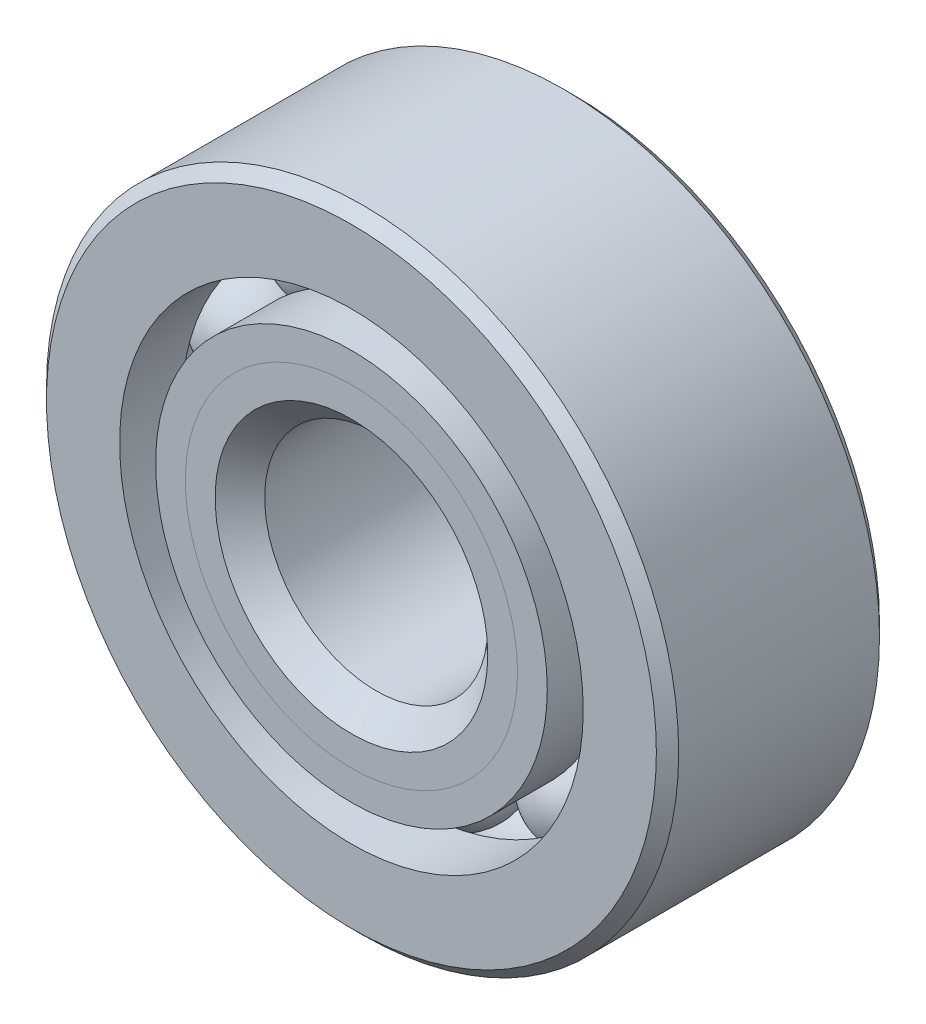
ISO-10303-21;
HEADER;
FILE_DESCRIPTION(('STEP AP214'),'2;1');
FILE_NAME('part.step','',(''),(''),'','','');
FILE_SCHEMA(('AUTOMOTIVE_DESIGN { 1 0 10303 214 1 1 1 1 }'));
ENDSEC;
DATA;
#1=APPLICATION_CONTEXT('core data for automotive mechanical design processes');
#2=APPLICATION_PROTOCOL_DEFINITION('international standard','automotive_design',2000,#1);
#3=PRODUCT_CONTEXT('',#1,'mechanical');
#4=PRODUCT('Part','Part','',(#3));
#5=PRODUCT_RELATED_PRODUCT_CATEGORY('part','',(#4));
#6=PRODUCT_DEFINITION_FORMATION('','',#4);
#7=PRODUCT_DEFINITION_CONTEXT('part definition',#1,'design');
#8=PRODUCT_DEFINITION('design','',#6,#7);
#9=PRODUCT_DEFINITION_SHAPE('','',#8);
#10=(LENGTH_UNIT() NAMED_UNIT(*) SI_UNIT(.MILLI.,.METRE.));
#11=(NAMED_UNIT(*) PLANE_ANGLE_UNIT() SI_UNIT($,.RADIAN.));
#12=(NAMED_UNIT(*) SI_UNIT($,.STERADIAN.) SOLID_ANGLE_UNIT());
#13=UNCERTAINTY_MEASURE_WITH_UNIT(LENGTH_MEASURE(1.E-05),#10,'distance_accuracy_value','');
#14=(GEOMETRIC_REPRESENTATION_CONTEXT(3) GLOBAL_UNCERTAINTY_ASSIGNED_CONTEXT((#13)) GLOBAL_UNIT_ASSIGNED_CONTEXT((#10,
#11,#12)) REPRESENTATION_CONTEXT('',''));
#15=CARTESIAN_POINT('',(0.,0.,0.));
#16=DIRECTION('',(0.,0.,1.));
#17=DIRECTION('',(1.,0.,0.));
#18=AXIS2_PLACEMENT_3D('',#15,#16,#17);
#19=CARTESIAN_POINT('',(-3.37976520068166,4.65184771765599,0.));
#20=DIRECTION('',(0.,0.,1.));
#21=DIRECTION('',(-0.587785252292462,0.809016994374955,0.));
#22=AXIS2_PLACEMENT_3D('',#19,#20,#21);
#23=SPHERICAL_SURFACE('',#22,1.41829685454418);
#24=CARTESIAN_POINT('',(-3.37976520068166,4.65184771765599,1.41829685454418));
#25=VERTEX_POINT('',#24);
#26=VERTEX_LOOP('',#25);
#27=FACE_BOUND('',#26,.T.);
#28=ADVANCED_FACE('F37',(#27),#23,.T.);
#29=CLOSED_SHELL('',(#28));
#30=MANIFOLD_SOLID_BREP('B2',#29);
#31=CARTESIAN_POINT('',(-5.46857496869711,1.77684771765601,0.));
#32=DIRECTION('',(0.,0.,1.));
#33=DIRECTION('',(-0.95105651629515,0.309016994374958,0.));
#34=AXIS2_PLACEMENT_3D('',#31,#32,#33);
#35=SPHERICAL_SURFACE('',#34,1.41829685454418);
#36=CARTESIAN_POINT('',(-5.46857496869711,1.77684771765601,1.41829685454418));
#37=VERTEX_POINT('',#36);
#38=VERTEX_LOOP('',#37);
#39=FACE_BOUND('',#38,.T.);
#40=ADVANCED_FACE('F68',(#39),#35,.T.);
#41=CLOSED_SHELL('',(#40));
#42=MANIFOLD_SOLID_BREP('B6',#41);
#43=CARTESIAN_POINT('',(-5.46857496869715,-1.7768477176559,0.));
#44=DIRECTION('',(0.,0.,1.));
#45=DIRECTION('',(-0.951056516295157,-0.309016994374938,0.));
#46=AXIS2_PLACEMENT_3D('',#43,#44,#45);
#47=SPHERICAL_SURFACE('',#46,1.41829685454418);
#48=CARTESIAN_POINT('',(-5.46857496869715,-1.7768477176559,1.41829685454418));
#49=VERTEX_POINT('',#48);
#50=VERTEX_LOOP('',#49);
#51=FACE_BOUND('',#50,.T.);
#52=ADVANCED_FACE('F99',(#51),#47,.T.);
#53=CLOSED_SHELL('',(#52));
#54=MANIFOLD_SOLID_BREP('B33',#53);
#55=CARTESIAN_POINT('',(-3.37976520068176,-4.65184771765592,0.));
#56=DIRECTION('',(0.,0.,1.));
#57=DIRECTION('',(-0.58778525229248,-0.809016994374942,0.));
#58=AXIS2_PLACEMENT_3D('',#55,#56,#57);
#59=SPHERICAL_SURFACE('',#58,1.41829685454418);
#60=CARTESIAN_POINT('',(-3.37976520068176,-4.65184771765592,1.41829685454418));
#61=VERTEX_POINT('',#60);
#62=VERTEX_LOOP('',#61);
#63=FACE_BOUND('',#62,.T.);
#64=ADVANCED_FACE('F130',(#63),#59,.T.);
#65=CLOSED_SHELL('',(#64));
#66=MANIFOLD_SOLID_BREP('B64',#65);
#67=CARTESIAN_POINT('',(0.,-5.75,0.));
#68=DIRECTION('',(0.,0.,1.));
#69=DIRECTION('',(0.,-1.,0.));
#70=AXIS2_PLACEMENT_3D('',#67,#68,#69);
#71=SPHERICAL_SURFACE('',#70,1.41829685454418);
#72=CARTESIAN_POINT('',(0.,-5.75,1.41829685454418));
#73=VERTEX_POINT('',#72);
#74=VERTEX_LOOP('',#73);
#75=FACE_BOUND('',#74,.T.);
#76=ADVANCED_FACE('F161',(#75),#71,.T.);
#77=CLOSED_SHELL('',(#76));
#78=MANIFOLD_SOLID_BREP('B95',#77);
#79=CARTESIAN_POINT('',(3.37976520068169,-4.65184771765597,0.));
#80=DIRECTION('',(0.,0.,1.));
#81=DIRECTION('',(0.587785252292469,-0.809016994374951,0.));
#82=AXIS2_PLACEMENT_3D('',#79,#80,#81);
#83=SPHERICAL_SURFACE('',#82,1.41829685454418);
#84=CARTESIAN_POINT('',(3.37976520068169,-4.65184771765597,1.41829685454418));
#85=VERTEX_POINT('',#84);
#86=VERTEX_LOOP('',#85);
#87=FACE_BOUND('',#86,.T.);
#88=ADVANCED_FACE('F192',(#87),#83,.T.);
#89=CLOSED_SHELL('',(#88));
#90=MANIFOLD_SOLID_BREP('B126',#89);
#91=CARTESIAN_POINT('',(5.46857496869713,-1.77684771765597,0.));
#92=DIRECTION('',(0.,0.,1.));
#93=DIRECTION('',(0.951056516295152,-0.309016994374952,0.));
#94=AXIS2_PLACEMENT_3D('',#91,#92,#93);
#95=SPHERICAL_SURFACE('',#94,1.41829685454418);
#96=CARTESIAN_POINT('',(5.46857496869713,-1.77684771765597,1.41829685454418));
#97=VERTEX_POINT('',#96);
#98=VERTEX_LOOP('',#97);
#99=FACE_BOUND('',#98,.T.);
#100=ADVANCED_FACE('F223',(#99),#95,.T.);
#101=CLOSED_SHELL('',(#100));
#102=MANIFOLD_SOLID_BREP('B157',#101);
#103=CARTESIAN_POINT('',(5.46857496869714,1.77684771765593,0.));
#104=DIRECTION('',(0.,0.,1.));
#105=DIRECTION('',(0.951056516295155,0.309016994374945,0.));
#106=AXIS2_PLACEMENT_3D('',#103,#104,#105);
#107=SPHERICAL_SURFACE('',#106,1.41829685454418);
#108=CARTESIAN_POINT('',(5.46857496869714,1.77684771765593,1.41829685454418));
#109=VERTEX_POINT('',#108);
#110=VERTEX_LOOP('',#109);
#111=FACE_BOUND('',#110,.T.);
#112=ADVANCED_FACE('F254',(#111),#107,.T.);
#113=CLOSED_SHELL('',(#112));
#114=MANIFOLD_SOLID_BREP('B188',#113);
#115=CARTESIAN_POINT('',(3.37976520068173,4.65184771765594,0.));
#116=DIRECTION('',(0.,0.,1.));
#117=DIRECTION('',(0.587785252292474,0.809016994374947,0.));
#118=AXIS2_PLACEMENT_3D('',#115,#116,#117);
#119=SPHERICAL_SURFACE('',#118,1.41829685454418);
#120=CARTESIAN_POINT('',(3.37976520068173,4.65184771765594,1.41829685454418));
#121=VERTEX_POINT('',#120);
#122=VERTEX_LOOP('',#121);
#123=FACE_BOUND('',#122,.T.);
#124=ADVANCED_FACE('F285',(#123),#119,.T.);
#125=CLOSED_SHELL('',(#124));
#126=MANIFOLD_SOLID_BREP('B219',#125);
#127=CARTESIAN_POINT('',(0.,5.75,0.));
#128=DIRECTION('',(0.,0.,1.));
#129=DIRECTION('',(0.,1.,0.));
#130=AXIS2_PLACEMENT_3D('',#127,#128,#129);
#131=SPHERICAL_SURFACE('',#130,1.41829685454418);
#132=CARTESIAN_POINT('',(0.,5.75,1.41829685454418));
#133=VERTEX_POINT('',#132);
#134=VERTEX_LOOP('',#133);
#135=FACE_BOUND('',#134,.T.);
#136=ADVANCED_FACE('F318',(#135),#131,.T.);
#137=CLOSED_SHELL('',(#136));
#138=MANIFOLD_SOLID_BREP('B250',#137);
#139=CARTESIAN_POINT('',(0.,4.46616754460571,3.));
#140=DIRECTION('',(0.,0.,-1.));
#141=DIRECTION('',(-1.,0.,0.));
#142=AXIS2_PLACEMENT_3D('',#139,#140,#141);
#143=PLANE('',#142);
#144=CARTESIAN_POINT('',(0.,0.,3.));
#145=DIRECTION('',(0.,0.,1.));
#146=DIRECTION('',(1.,0.,0.));
#147=AXIS2_PLACEMENT_3D('',#144,#145,#146);
#148=CIRCLE('',#147,3.66585157272791);
#149=CARTESIAN_POINT('',(3.66585157272791,0.,3.));
#150=VERTEX_POINT('',#149);
#151=EDGE_CURVE('E372',#150,#150,#148,.T.);
#152=ORIENTED_EDGE('',*,*,#151,.F.);
#153=EDGE_LOOP('',(#152));
#154=FACE_BOUND('',#153,.T.);
#155=CARTESIAN_POINT('',(0.,0.,3.));
#156=DIRECTION('',(0.,0.,1.));
#157=DIRECTION('',(1.,0.,0.));
#158=AXIS2_PLACEMENT_3D('',#155,#156,#157);
#159=CIRCLE('',#158,4.46616754460571);
#160=CARTESIAN_POINT('',(4.46616754460571,0.,3.));
#161=VERTEX_POINT('',#160);
#162=EDGE_CURVE('E317',#161,#161,#159,.T.);
#163=ORIENTED_EDGE('',*,*,#162,.T.);
#164=EDGE_LOOP('',(#163));
#165=FACE_BOUND('',#164,.T.);
#166=ADVANCED_FACE('F338',(#154,#165),#143,.F.);
#167=CARTESIAN_POINT('',(0.,0.,2.1996840281222));
#168=DIRECTION('',(0.,0.,1.));
#169=DIRECTION('',(1.,0.,0.));
#170=AXIS2_PLACEMENT_3D('',#167,#168,#169);
#171=CONICAL_SURFACE('',#170,3.66585157272791,0.785398163397449);
#172=ORIENTED_EDGE('',*,*,#162,.F.);
#173=EDGE_LOOP('',(#172));
#174=FACE_BOUND('',#173,.T.);
#175=CARTESIAN_POINT('',(0.,0.,2.1996840281222));
#176=DIRECTION('',(0.,0.,1.));
#177=DIRECTION('',(1.,0.,0.));
#178=AXIS2_PLACEMENT_3D('',#175,#176,#177);
#179=CIRCLE('',#178,3.66585157272791);
#180=CARTESIAN_POINT('',(3.66585157272791,0.,2.1996840281222));
#181=VERTEX_POINT('',#180);
#182=EDGE_CURVE('E344',#181,#181,#179,.T.);
#183=ORIENTED_EDGE('',*,*,#182,.T.);
#184=EDGE_LOOP('',(#183));
#185=FACE_BOUND('',#184,.T.);
#186=ADVANCED_FACE('F379',(#174,#185),#171,.T.);
#187=CARTESIAN_POINT('',(0.,0.,3.));
#188=DIRECTION('',(0.,0.,1.));
#189=DIRECTION('',(1.,0.,0.));
#190=AXIS2_PLACEMENT_3D('',#187,#188,#189);
#191=CYLINDRICAL_SURFACE('',#190,3.66585157272791);
#192=ORIENTED_EDGE('',*,*,#182,.F.);
#193=EDGE_LOOP('',(#192));
#194=FACE_BOUND('',#193,.T.);
#195=CARTESIAN_POINT('',(0.,0.,0.));
#196=DIRECTION('',(0.,0.,1.));
#197=DIRECTION('',(1.,0.,0.));
#198=AXIS2_PLACEMENT_3D('',#195,#196,#197);
#199=CIRCLE('',#198,3.66585157272791);
#200=CARTESIAN_POINT('',(3.66585157272791,0.,0.));
#201=VERTEX_POINT('',#200);
#202=EDGE_CURVE('E348',#201,#201,#199,.T.);
#203=ORIENTED_EDGE('',*,*,#202,.T.);
#204=EDGE_LOOP('',(#203));
#205=FACE_BOUND('',#204,.T.);
#206=ADVANCED_FACE('F383',(#194,#205),#191,.T.);
#207=CARTESIAN_POINT('',(0.,3.66585157272791,0.));
#208=DIRECTION('',(0.,0.,-1.));
#209=DIRECTION('',(-1.,0.,0.));
#210=AXIS2_PLACEMENT_3D('',#207,#208,#209);
#211=PLANE('',#210);
#212=ORIENTED_EDGE('',*,*,#202,.F.);
#213=EDGE_LOOP('',(#212));
#214=FACE_BOUND('',#213,.T.);
#215=CARTESIAN_POINT('',(0.,0.,0.));
#216=DIRECTION('',(0.,0.,1.));
#217=DIRECTION('',(1.,0.,0.));
#218=AXIS2_PLACEMENT_3D('',#215,#216,#217);
#219=CIRCLE('',#218,4.33170314545582);
#220=CARTESIAN_POINT('',(4.33170314545582,0.,0.));
#221=VERTEX_POINT('',#220);
#222=EDGE_CURVE('E352',#221,#221,#219,.T.);
#223=ORIENTED_EDGE('',*,*,#222,.T.);
#224=EDGE_LOOP('',(#223));
#225=FACE_BOUND('',#224,.T.);
#226=ADVANCED_FACE('F388',(#214,#225),#211,.F.);
#227=CARTESIAN_POINT('',(0.,0.,0.));
#228=DIRECTION('',(0.,0.,1.));
#229=DIRECTION('',(1.,0.,0.));
#230=AXIS2_PLACEMENT_3D('',#227,#228,#229);
#231=TOROIDAL_SURFACE('',#230,5.75,1.41829685454418);
#232=ORIENTED_EDGE('',*,*,#222,.F.);
#233=EDGE_LOOP('',(#232));
#234=FACE_BOUND('',#233,.T.);
#235=CARTESIAN_POINT('',(0.,0.,-1.33333333333333));
#236=DIRECTION('',(0.,0.,1.));
#237=DIRECTION('',(1.,0.,0.));
#238=AXIS2_PLACEMENT_3D('',#235,#236,#237);
#239=CIRCLE('',#238,5.26648351648352);
#240=CARTESIAN_POINT('',(5.26648351648352,0.,-1.33333333333333));
#241=VERTEX_POINT('',#240);
#242=EDGE_CURVE('E357',#241,#241,#239,.T.);
#243=ORIENTED_EDGE('',*,*,#242,.T.);
#244=EDGE_LOOP('',(#243));
#245=FACE_BOUND('',#244,.T.);
#246=ADVANCED_FACE('F394',(#234,#245),#231,.F.);
#247=CARTESIAN_POINT('',(0.,0.,3.));
#248=DIRECTION('',(0.,0.,1.));
#249=DIRECTION('',(1.,0.,0.));
#250=AXIS2_PLACEMENT_3D('',#247,#248,#249);
#251=CYLINDRICAL_SURFACE('',#250,5.26648351648352);
#252=ORIENTED_EDGE('',*,*,#242,.F.);
#253=EDGE_LOOP('',(#252));
#254=FACE_BOUND('',#253,.T.);
#255=CARTESIAN_POINT('',(0.,0.,-3.));
#256=DIRECTION('',(0.,0.,1.));
#257=DIRECTION('',(1.,0.,0.));
#258=AXIS2_PLACEMENT_3D('',#255,#256,#257);
#259=CIRCLE('',#258,5.26648351648352);
#260=CARTESIAN_POINT('',(5.26648351648352,0.,-3.));
#261=VERTEX_POINT('',#260);
#262=EDGE_CURVE('E360',#261,#261,#259,.T.);
#263=ORIENTED_EDGE('',*,*,#262,.T.);
#264=EDGE_LOOP('',(#263));
#265=FACE_BOUND('',#264,.T.);
#266=ADVANCED_FACE('F398',(#254,#265),#251,.T.);
#267=CARTESIAN_POINT('',(0.,3.3,-3.));
#268=DIRECTION('',(0.,0.,1.));
#269=DIRECTION('',(1.,0.,0.));
#270=AXIS2_PLACEMENT_3D('',#267,#268,#269);
#271=PLANE('',#270);
#272=ORIENTED_EDGE('',*,*,#262,.F.);
#273=EDGE_LOOP('',(#272));
#274=FACE_BOUND('',#273,.T.);
#275=CARTESIAN_POINT('',(0.,0.,-3.));
#276=DIRECTION('',(0.,0.,1.));
#277=DIRECTION('',(1.,0.,0.));
#278=AXIS2_PLACEMENT_3D('',#275,#276,#277);
#279=CIRCLE('',#278,3.3);
#280=CARTESIAN_POINT('',(3.3,0.,-3.));
#281=VERTEX_POINT('',#280);
#282=EDGE_CURVE('E363',#281,#281,#279,.T.);
#283=ORIENTED_EDGE('',*,*,#282,.T.);
#284=EDGE_LOOP('',(#283));
#285=FACE_BOUND('',#284,.T.);
#286=ADVANCED_FACE('F402',(#274,#285),#271,.F.);
#287=CARTESIAN_POINT('',(0.,0.,-2.7));
#288=DIRECTION('',(0.,0.,-1.));
#289=DIRECTION('',(-1.,0.,0.));
#290=AXIS2_PLACEMENT_3D('',#287,#288,#289);
#291=CONICAL_SURFACE('',#290,3.,0.785398163397448);
#292=ORIENTED_EDGE('',*,*,#282,.F.);
#293=EDGE_LOOP('',(#292));
#294=FACE_BOUND('',#293,.T.);
#295=CARTESIAN_POINT('',(0.,0.,-2.7));
#296=DIRECTION('',(0.,0.,1.));
#297=DIRECTION('',(1.,0.,0.));
#298=AXIS2_PLACEMENT_3D('',#295,#296,#297);
#299=CIRCLE('',#298,3.);
#300=CARTESIAN_POINT('',(3.,0.,-2.7));
#301=VERTEX_POINT('',#300);
#302=EDGE_CURVE('E366',#301,#301,#299,.T.);
#303=ORIENTED_EDGE('',*,*,#302,.T.);
#304=EDGE_LOOP('',(#303));
#305=FACE_BOUND('',#304,.T.);
#306=ADVANCED_FACE('F406',(#294,#305),#291,.F.);
#307=CARTESIAN_POINT('',(0.,0.,3.));
#308=DIRECTION('',(0.,0.,1.));
#309=DIRECTION('',(1.,0.,0.));
#310=AXIS2_PLACEMENT_3D('',#307,#308,#309);
#311=CYLINDRICAL_SURFACE('',#310,3.);
#312=ORIENTED_EDGE('',*,*,#302,.F.);
#313=EDGE_LOOP('',(#312));
#314=FACE_BOUND('',#313,.T.);
#315=CARTESIAN_POINT('',(0.,0.,2.33414842727209));
#316=DIRECTION('',(0.,0.,1.));
#317=DIRECTION('',(1.,0.,0.));
#318=AXIS2_PLACEMENT_3D('',#315,#316,#317);
#319=CIRCLE('',#318,3.);
#320=CARTESIAN_POINT('',(3.,0.,2.33414842727209));
#321=VERTEX_POINT('',#320);
#322=EDGE_CURVE('E369',#321,#321,#319,.T.);
#323=ORIENTED_EDGE('',*,*,#322,.T.);
#324=EDGE_LOOP('',(#323));
#325=FACE_BOUND('',#324,.T.);
#326=ADVANCED_FACE('F410',(#314,#325),#311,.F.);
#327=CARTESIAN_POINT('',(0.,0.,3.));
#328=DIRECTION('',(0.,0.,1.));
#329=DIRECTION('',(1.,0.,0.));
#330=AXIS2_PLACEMENT_3D('',#327,#328,#329);
#331=CONICAL_SURFACE('',#330,3.66585157272791,0.785398163397449);
#332=ORIENTED_EDGE('',*,*,#322,.F.);
#333=EDGE_LOOP('',(#332));
#334=FACE_BOUND('',#333,.T.);
#335=ORIENTED_EDGE('',*,*,#151,.T.);
#336=EDGE_LOOP('',(#335));
#337=FACE_BOUND('',#336,.T.);
#338=ADVANCED_FACE('F376',(#334,#337),#331,.F.);
#339=CLOSED_SHELL('',(#166,#186,#206,#226,#246,#266,#286,#306,#326,#338));
#340=MANIFOLD_SOLID_BREP('B281',#339);
#341=CARTESIAN_POINT('',(0.,5.26648351648352,3.));
#342=DIRECTION('',(0.,0.,-1.));
#343=DIRECTION('',(-1.,0.,0.));
#344=AXIS2_PLACEMENT_3D('',#341,#342,#343);
#345=PLANE('',#344);
#346=CARTESIAN_POINT('',(0.,0.,3.));
#347=DIRECTION('',(0.,0.,1.));
#348=DIRECTION('',(1.,0.,0.));
#349=AXIS2_PLACEMENT_3D('',#346,#347,#348);
#350=CIRCLE('',#349,4.46616754460571);
#351=CARTESIAN_POINT('',(4.46616754460571,0.,3.));
#352=VERTEX_POINT('',#351);
#353=EDGE_CURVE('E337',#352,#352,#350,.T.);
#354=ORIENTED_EDGE('',*,*,#353,.F.);
#355=EDGE_LOOP('',(#354));
#356=FACE_BOUND('',#355,.T.);
#357=CARTESIAN_POINT('',(0.,0.,3.));
#358=DIRECTION('',(0.,0.,1.));
#359=DIRECTION('',(1.,0.,0.));
#360=AXIS2_PLACEMENT_3D('',#357,#358,#359);
#361=CIRCLE('',#360,5.26648351648352);
#362=CARTESIAN_POINT('',(5.26648351648352,0.,3.));
#363=VERTEX_POINT('',#362);
#364=EDGE_CURVE('E518',#363,#363,#361,.T.);
#365=ORIENTED_EDGE('',*,*,#364,.T.);
#366=EDGE_LOOP('',(#365));
#367=FACE_BOUND('',#366,.T.);
#368=ADVANCED_FACE('F496',(#356,#367),#345,.F.);
#369=CARTESIAN_POINT('',(0.,0.,3.));
#370=DIRECTION('',(0.,0.,1.));
#371=DIRECTION('',(1.,0.,0.));
#372=AXIS2_PLACEMENT_3D('',#369,#370,#371);
#373=CONICAL_SURFACE('',#372,4.46616754460571,0.785398163397449);
#374=CARTESIAN_POINT('',(0.,0.,2.1996840281222));
#375=DIRECTION('',(0.,0.,1.));
#376=DIRECTION('',(1.,0.,0.));
#377=AXIS2_PLACEMENT_3D('',#374,#375,#376);
#378=CIRCLE('',#377,3.66585157272791);
#379=CARTESIAN_POINT('',(3.66585157272791,0.,2.1996840281222));
#380=VERTEX_POINT('',#379);
#381=EDGE_CURVE('E502',#380,#380,#378,.T.);
#382=ORIENTED_EDGE('',*,*,#381,.F.);
#383=EDGE_LOOP('',(#382));
#384=FACE_BOUND('',#383,.T.);
#385=ORIENTED_EDGE('',*,*,#353,.T.);
#386=EDGE_LOOP('',(#385));
#387=FACE_BOUND('',#386,.T.);
#388=ADVANCED_FACE('F543',(#384,#387),#373,.F.);
#389=CARTESIAN_POINT('',(0.,0.,3.));
#390=DIRECTION('',(0.,0.,1.));
#391=DIRECTION('',(1.,0.,0.));
#392=AXIS2_PLACEMENT_3D('',#389,#390,#391);
#393=CYLINDRICAL_SURFACE('',#392,3.66585157272791);
#394=CARTESIAN_POINT('',(0.,0.,0.));
#395=DIRECTION('',(0.,0.,1.));
#396=DIRECTION('',(1.,0.,0.));
#397=AXIS2_PLACEMENT_3D('',#394,#395,#396);
#398=CIRCLE('',#397,3.66585157272791);
#399=CARTESIAN_POINT('',(3.66585157272791,0.,0.));
#400=VERTEX_POINT('',#399);
#401=EDGE_CURVE('E506',#400,#400,#398,.T.);
#402=ORIENTED_EDGE('',*,*,#401,.F.);
#403=EDGE_LOOP('',(#402));
#404=FACE_BOUND('',#403,.T.);
#405=ORIENTED_EDGE('',*,*,#381,.T.);
#406=EDGE_LOOP('',(#405));
#407=FACE_BOUND('',#406,.T.);
#408=ADVANCED_FACE('F538',(#404,#407),#393,.F.);
#409=CARTESIAN_POINT('',(0.,3.66585157272791,0.));
#410=DIRECTION('',(0.,0.,1.));
#411=DIRECTION('',(1.,0.,0.));
#412=AXIS2_PLACEMENT_3D('',#409,#410,#411);
#413=PLANE('',#412);
#414=CARTESIAN_POINT('',(0.,0.,0.));
#415=DIRECTION('',(0.,0.,1.));
#416=DIRECTION('',(1.,0.,0.));
#417=AXIS2_PLACEMENT_3D('',#414,#415,#416);
#418=CIRCLE('',#417,4.33170314545582);
#419=CARTESIAN_POINT('',(4.33170314545582,0.,0.));
#420=VERTEX_POINT('',#419);
#421=EDGE_CURVE('E510',#420,#420,#418,.T.);
#422=ORIENTED_EDGE('',*,*,#421,.F.);
#423=EDGE_LOOP('',(#422));
#424=FACE_BOUND('',#423,.T.);
#425=ORIENTED_EDGE('',*,*,#401,.T.);
#426=EDGE_LOOP('',(#425));
#427=FACE_BOUND('',#426,.T.);
#428=ADVANCED_FACE('F532',(#424,#427),#413,.F.);
#429=CARTESIAN_POINT('',(0.,0.,0.));
#430=DIRECTION('',(0.,0.,1.));
#431=DIRECTION('',(1.,0.,0.));
#432=AXIS2_PLACEMENT_3D('',#429,#430,#431);
#433=TOROIDAL_SURFACE('',#432,5.75,1.41829685454418);
#434=CARTESIAN_POINT('',(0.,0.,1.33333333333333));
#435=DIRECTION('',(0.,0.,1.));
#436=DIRECTION('',(1.,0.,0.));
#437=AXIS2_PLACEMENT_3D('',#434,#435,#436);
#438=CIRCLE('',#437,5.26648351648352);
#439=CARTESIAN_POINT('',(5.26648351648352,0.,1.33333333333333));
#440=VERTEX_POINT('',#439);
#441=EDGE_CURVE('E515',#440,#440,#438,.T.);
#442=ORIENTED_EDGE('',*,*,#441,.F.);
#443=EDGE_LOOP('',(#442));
#444=FACE_BOUND('',#443,.T.);
#445=ORIENTED_EDGE('',*,*,#421,.T.);
#446=EDGE_LOOP('',(#445));
#447=FACE_BOUND('',#446,.T.);
#448=ADVANCED_FACE('F526',(#444,#447),#433,.F.);
#449=CARTESIAN_POINT('',(0.,0.,3.));
#450=DIRECTION('',(0.,0.,1.));
#451=DIRECTION('',(1.,0.,0.));
#452=AXIS2_PLACEMENT_3D('',#449,#450,#451);
#453=CYLINDRICAL_SURFACE('',#452,5.26648351648352);
#454=ORIENTED_EDGE('',*,*,#364,.F.);
#455=EDGE_LOOP('',(#454));
#456=FACE_BOUND('',#455,.T.);
#457=ORIENTED_EDGE('',*,*,#441,.T.);
#458=EDGE_LOOP('',(#457));
#459=FACE_BOUND('',#458,.T.);
#460=ADVANCED_FACE('F523',(#456,#459),#453,.T.);
#461=CLOSED_SHELL('',(#368,#388,#408,#428,#448,#460));
#462=MANIFOLD_SOLID_BREP('B312',#461);
#463=CARTESIAN_POINT('',(0.,0.,2.7));
#464=DIRECTION('',(0.,0.,-1.));
#465=DIRECTION('',(-1.,0.,0.));
#466=AXIS2_PLACEMENT_3D('',#463,#464,#465);
#467=CONICAL_SURFACE('',#466,8.5,0.785398163397448);
#468=CARTESIAN_POINT('',(0.,0.,3.));
#469=DIRECTION('',(0.,0.,1.));
#470=DIRECTION('',(1.,0.,0.));
#471=AXIS2_PLACEMENT_3D('',#468,#469,#470);
#472=CIRCLE('',#471,8.2);
#473=CARTESIAN_POINT('',(8.2,0.,3.));
#474=VERTEX_POINT('',#473);
#475=EDGE_CURVE('E615',#474,#474,#472,.T.);
#476=ORIENTED_EDGE('',*,*,#475,.F.);
#477=EDGE_LOOP('',(#476));
#478=FACE_BOUND('',#477,.T.);
#479=CARTESIAN_POINT('',(0.,0.,2.7));
#480=DIRECTION('',(0.,0.,1.));
#481=DIRECTION('',(1.,0.,0.));
#482=AXIS2_PLACEMENT_3D('',#479,#480,#481);
#483=CIRCLE('',#482,8.5);
#484=CARTESIAN_POINT('',(8.5,0.,2.7));
#485=VERTEX_POINT('',#484);
#486=EDGE_CURVE('E495',#485,#485,#483,.T.);
#487=ORIENTED_EDGE('',*,*,#486,.T.);
#488=EDGE_LOOP('',(#487));
#489=FACE_BOUND('',#488,.T.);
#490=ADVANCED_FACE('F587',(#478,#489),#467,.T.);
#491=CARTESIAN_POINT('',(0.,0.,3.));
#492=DIRECTION('',(0.,0.,1.));
#493=DIRECTION('',(1.,0.,0.));
#494=AXIS2_PLACEMENT_3D('',#491,#492,#493);
#495=CYLINDRICAL_SURFACE('',#494,8.5);
#496=ORIENTED_EDGE('',*,*,#486,.F.);
#497=EDGE_LOOP('',(#496));
#498=FACE_BOUND('',#497,.T.);
#499=CARTESIAN_POINT('',(0.,0.,-2.7));
#500=DIRECTION('',(0.,0.,1.));
#501=DIRECTION('',(1.,0.,0.));
#502=AXIS2_PLACEMENT_3D('',#499,#500,#501);
#503=CIRCLE('',#502,8.5);
#504=CARTESIAN_POINT('',(8.5,0.,-2.7));
#505=VERTEX_POINT('',#504);
#506=EDGE_CURVE('E593',#505,#505,#503,.T.);
#507=ORIENTED_EDGE('',*,*,#506,.T.);
#508=EDGE_LOOP('',(#507));
#509=FACE_BOUND('',#508,.T.);
#510=ADVANCED_FACE('F622',(#498,#509),#495,.T.);
#511=CARTESIAN_POINT('',(0.,0.,-3.));
#512=DIRECTION('',(0.,0.,1.));
#513=DIRECTION('',(1.,0.,0.));
#514=AXIS2_PLACEMENT_3D('',#511,#512,#513);
#515=CONICAL_SURFACE('',#514,8.2,0.785398163397447);
#516=ORIENTED_EDGE('',*,*,#506,.F.);
#517=EDGE_LOOP('',(#516));
#518=FACE_BOUND('',#517,.T.);
#519=CARTESIAN_POINT('',(0.,0.,-3.));
#520=DIRECTION('',(0.,0.,1.));
#521=DIRECTION('',(1.,0.,0.));
#522=AXIS2_PLACEMENT_3D('',#519,#520,#521);
#523=CIRCLE('',#522,8.2);
#524=CARTESIAN_POINT('',(8.2,0.,-3.));
#525=VERTEX_POINT('',#524);
#526=EDGE_CURVE('E597',#525,#525,#523,.T.);
#527=ORIENTED_EDGE('',*,*,#526,.T.);
#528=EDGE_LOOP('',(#527));
#529=FACE_BOUND('',#528,.T.);
#530=ADVANCED_FACE('F626',(#518,#529),#515,.T.);
#531=CARTESIAN_POINT('',(0.,8.2,-3.));
#532=DIRECTION('',(0.,0.,1.));
#533=DIRECTION('',(1.,0.,0.));
#534=AXIS2_PLACEMENT_3D('',#531,#532,#533);
#535=PLANE('',#534);
#536=ORIENTED_EDGE('',*,*,#526,.F.);
#537=EDGE_LOOP('',(#536));
#538=FACE_BOUND('',#537,.T.);
#539=CARTESIAN_POINT('',(0.,0.,-3.));
#540=DIRECTION('',(0.,0.,1.));
#541=DIRECTION('',(1.,0.,0.));
#542=AXIS2_PLACEMENT_3D('',#539,#540,#541);
#543=CIRCLE('',#542,6.23351648351648);
#544=CARTESIAN_POINT('',(6.23351648351648,0.,-3.));
#545=VERTEX_POINT('',#544);
#546=EDGE_CURVE('E601',#545,#545,#543,.T.);
#547=ORIENTED_EDGE('',*,*,#546,.T.);
#548=EDGE_LOOP('',(#547));
#549=FACE_BOUND('',#548,.T.);
#550=ADVANCED_FACE('F631',(#538,#549),#535,.F.);
#551=CARTESIAN_POINT('',(0.,0.,3.));
#552=DIRECTION('',(0.,0.,1.));
#553=DIRECTION('',(1.,0.,0.));
#554=AXIS2_PLACEMENT_3D('',#551,#552,#553);
#555=CYLINDRICAL_SURFACE('',#554,6.23351648351648);
#556=ORIENTED_EDGE('',*,*,#546,.F.);
#557=EDGE_LOOP('',(#556));
#558=FACE_BOUND('',#557,.T.);
#559=CARTESIAN_POINT('',(0.,0.,-1.33333333333334));
#560=DIRECTION('',(0.,0.,1.));
#561=DIRECTION('',(1.,0.,0.));
#562=AXIS2_PLACEMENT_3D('',#559,#560,#561);
#563=CIRCLE('',#562,6.23351648351648);
#564=CARTESIAN_POINT('',(6.23351648351648,0.,-1.33333333333334));
#565=VERTEX_POINT('',#564);
#566=EDGE_CURVE('E606',#565,#565,#563,.T.);
#567=ORIENTED_EDGE('',*,*,#566,.T.);
#568=EDGE_LOOP('',(#567));
#569=FACE_BOUND('',#568,.T.);
#570=ADVANCED_FACE('F637',(#558,#569),#555,.F.);
#571=CARTESIAN_POINT('',(0.,0.,0.));
#572=DIRECTION('',(0.,0.,1.));
#573=DIRECTION('',(1.,0.,0.));
#574=AXIS2_PLACEMENT_3D('',#571,#572,#573);
#575=TOROIDAL_SURFACE('',#574,5.75,1.41829685454418);
#576=ORIENTED_EDGE('',*,*,#566,.F.);
#577=EDGE_LOOP('',(#576));
#578=FACE_BOUND('',#577,.T.);
#579=CARTESIAN_POINT('',(0.,0.,1.33333333333333));
#580=DIRECTION('',(0.,0.,1.));
#581=DIRECTION('',(1.,0.,0.));
#582=AXIS2_PLACEMENT_3D('',#579,#580,#581);
#583=CIRCLE('',#582,6.23351648351648);
#584=CARTESIAN_POINT('',(6.23351648351648,0.,1.33333333333333));
#585=VERTEX_POINT('',#584);
#586=EDGE_CURVE('E609',#585,#585,#583,.T.);
#587=ORIENTED_EDGE('',*,*,#586,.T.);
#588=EDGE_LOOP('',(#587));
#589=FACE_BOUND('',#588,.T.);
#590=ADVANCED_FACE('F641',(#578,#589),#575,.F.);
#591=CARTESIAN_POINT('',(0.,0.,3.));
#592=DIRECTION('',(0.,0.,1.));
#593=DIRECTION('',(1.,0.,0.));
#594=AXIS2_PLACEMENT_3D('',#591,#592,#593);
#595=CYLINDRICAL_SURFACE('',#594,6.23351648351648);
#596=ORIENTED_EDGE('',*,*,#586,.F.);
#597=EDGE_LOOP('',(#596));
#598=FACE_BOUND('',#597,.T.);
#599=CARTESIAN_POINT('',(0.,0.,3.));
#600=DIRECTION('',(0.,0.,1.));
#601=DIRECTION('',(1.,0.,0.));
#602=AXIS2_PLACEMENT_3D('',#599,#600,#601);
#603=CIRCLE('',#602,6.23351648351648);
#604=CARTESIAN_POINT('',(6.23351648351648,0.,3.));
#605=VERTEX_POINT('',#604);
#606=EDGE_CURVE('E612',#605,#605,#603,.T.);
#607=ORIENTED_EDGE('',*,*,#606,.T.);
#608=EDGE_LOOP('',(#607));
#609=FACE_BOUND('',#608,.T.);
#610=ADVANCED_FACE('F645',(#598,#609),#595,.F.);
#611=CARTESIAN_POINT('',(0.,8.2,3.));
#612=DIRECTION('',(0.,0.,-1.));
#613=DIRECTION('',(-1.,0.,0.));
#614=AXIS2_PLACEMENT_3D('',#611,#612,#613);
#615=PLANE('',#614);
#616=ORIENTED_EDGE('',*,*,#606,.F.);
#617=EDGE_LOOP('',(#616));
#618=FACE_BOUND('',#617,.T.);
#619=ORIENTED_EDGE('',*,*,#475,.T.);
#620=EDGE_LOOP('',(#619));
#621=FACE_BOUND('',#620,.T.);
#622=ADVANCED_FACE('F619',(#618,#621),#615,.F.);
#623=CLOSED_SHELL('',(#490,#510,#530,#550,#570,#590,#610,#622));
#624=MANIFOLD_SOLID_BREP('B332',#623);
#625=ADVANCED_BREP_SHAPE_REPRESENTATION('',(#18,#30,#42,#54,#66,#78,#90,#102,#114,#126,#138,
#340,#462,#624),#14);
#626=SHAPE_DEFINITION_REPRESENTATION(#9,#625);
ENDSEC;
END-ISO-10303-21;
